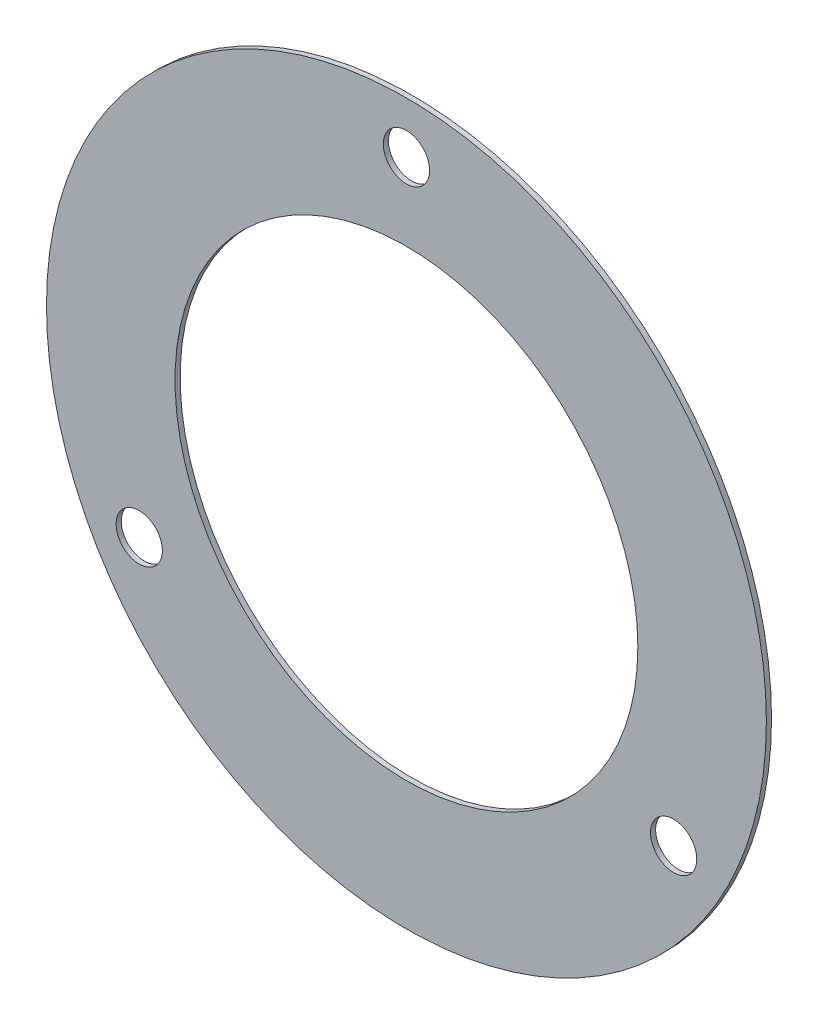
ISO-10303-21;
HEADER;
FILE_DESCRIPTION(('STEP AP214'),'2;1');
FILE_NAME('part.step','',(''),(''),'','','');
FILE_SCHEMA(('AUTOMOTIVE_DESIGN { 1 0 10303 214 1 1 1 1 }'));
ENDSEC;
DATA;
#1=APPLICATION_CONTEXT('core data for automotive mechanical design processes');
#2=APPLICATION_PROTOCOL_DEFINITION('international standard','automotive_design',2000,#1);
#3=PRODUCT_CONTEXT('',#1,'mechanical');
#4=PRODUCT('Part','Part','',(#3));
#5=PRODUCT_RELATED_PRODUCT_CATEGORY('part','',(#4));
#6=PRODUCT_DEFINITION_FORMATION('','',#4);
#7=PRODUCT_DEFINITION_CONTEXT('part definition',#1,'design');
#8=PRODUCT_DEFINITION('design','',#6,#7);
#9=PRODUCT_DEFINITION_SHAPE('','',#8);
#10=(LENGTH_UNIT() NAMED_UNIT(*) SI_UNIT(.MILLI.,.METRE.));
#11=(NAMED_UNIT(*) PLANE_ANGLE_UNIT() SI_UNIT($,.RADIAN.));
#12=(NAMED_UNIT(*) SI_UNIT($,.STERADIAN.) SOLID_ANGLE_UNIT());
#13=UNCERTAINTY_MEASURE_WITH_UNIT(LENGTH_MEASURE(1.E-05),#10,'distance_accuracy_value','');
#14=(GEOMETRIC_REPRESENTATION_CONTEXT(3) GLOBAL_UNCERTAINTY_ASSIGNED_CONTEXT((#13)) GLOBAL_UNIT_ASSIGNED_CONTEXT((#10,
#11,#12)) REPRESENTATION_CONTEXT('',''));
#15=CARTESIAN_POINT('',(0.,0.,0.));
#16=DIRECTION('',(0.,0.,1.));
#17=DIRECTION('',(1.,0.,0.));
#18=AXIS2_PLACEMENT_3D('',#15,#16,#17);
#19=CARTESIAN_POINT('',(0.,0.,1.));
#20=DIRECTION('',(0.,0.,1.));
#21=DIRECTION('',(1.,0.,0.));
#22=AXIS2_PLACEMENT_3D('',#19,#20,#21);
#23=PLANE('',#22);
#24=CARTESIAN_POINT('',(51.9615242270699,-30.0000000000027,1.));
#25=DIRECTION('',(0.,0.,1.));
#26=DIRECTION('',(1.,0.,0.));
#27=AXIS2_PLACEMENT_3D('',#24,#25,#26);
#28=CIRCLE('',#27,4.49999999999842);
#29=CARTESIAN_POINT('',(56.4615242270683,-30.0000000000027,1.));
#30=VERTEX_POINT('',#29);
#31=EDGE_CURVE('E49',#30,#30,#28,.T.);
#32=ORIENTED_EDGE('',*,*,#31,.F.);
#33=EDGE_LOOP('',(#32));
#34=FACE_BOUND('',#33,.T.);
#35=CARTESIAN_POINT('',(0.,0.,1.));
#36=DIRECTION('',(0.,0.,1.));
#37=DIRECTION('',(1.,0.,0.));
#38=AXIS2_PLACEMENT_3D('',#35,#36,#37);
#39=CIRCLE('',#38,45.);
#40=CARTESIAN_POINT('',(45.,0.,1.));
#41=VERTEX_POINT('',#40);
#42=EDGE_CURVE('E38',#41,#41,#39,.T.);
#43=ORIENTED_EDGE('',*,*,#42,.F.);
#44=EDGE_LOOP('',(#43));
#45=FACE_BOUND('',#44,.T.);
#46=CARTESIAN_POINT('',(0.,0.,1.));
#47=DIRECTION('',(0.,0.,1.));
#48=DIRECTION('',(1.,0.,0.));
#49=AXIS2_PLACEMENT_3D('',#46,#47,#48);
#50=CIRCLE('',#49,70.);
#51=CARTESIAN_POINT('',(70.,0.,1.));
#52=VERTEX_POINT('',#51);
#53=EDGE_CURVE('E10',#52,#52,#50,.T.);
#54=ORIENTED_EDGE('',*,*,#53,.T.);
#55=EDGE_LOOP('',(#54));
#56=FACE_BOUND('',#55,.T.);
#57=CARTESIAN_POINT('',(4.413136522885E-12,60.0000000000022,1.));
#58=DIRECTION('',(0.,0.,1.));
#59=DIRECTION('',(1.,0.,0.));
#60=AXIS2_PLACEMENT_3D('',#57,#58,#59);
#61=CIRCLE('',#60,4.49999999999514);
#62=CARTESIAN_POINT('',(4.49999999999955,60.0000000000022,1.));
#63=VERTEX_POINT('',#62);
#64=EDGE_CURVE('E43',#63,#63,#61,.T.);
#65=ORIENTED_EDGE('',*,*,#64,.F.);
#66=EDGE_LOOP('',(#65));
#67=FACE_BOUND('',#66,.T.);
#68=CARTESIAN_POINT('',(-51.9615242270666,-29.9999999999995,1.));
#69=DIRECTION('',(0.,0.,1.));
#70=DIRECTION('',(1.,0.,0.));
#71=AXIS2_PLACEMENT_3D('',#68,#69,#70);
#72=CIRCLE('',#71,4.5);
#73=CARTESIAN_POINT('',(-47.4615242270666,-29.9999999999995,1.));
#74=VERTEX_POINT('',#73);
#75=EDGE_CURVE('E55',#74,#74,#72,.T.);
#76=ORIENTED_EDGE('',*,*,#75,.F.);
#77=EDGE_LOOP('',(#76));
#78=FACE_BOUND('',#77,.T.);
#79=ADVANCED_FACE('F27',(#34,#45,#56,#67,#78),#23,.T.);
#80=CARTESIAN_POINT('',(0.,0.,0.));
#81=DIRECTION('',(0.,0.,1.));
#82=DIRECTION('',(1.,0.,0.));
#83=AXIS2_PLACEMENT_3D('',#80,#81,#82);
#84=PLANE('',#83);
#85=CARTESIAN_POINT('',(0.,0.,0.));
#86=DIRECTION('',(0.,0.,1.));
#87=DIRECTION('',(1.,0.,0.));
#88=AXIS2_PLACEMENT_3D('',#85,#86,#87);
#89=CIRCLE('',#88,70.);
#90=CARTESIAN_POINT('',(70.,0.,0.));
#91=VERTEX_POINT('',#90);
#92=EDGE_CURVE('E31',#91,#91,#89,.T.);
#93=ORIENTED_EDGE('',*,*,#92,.F.);
#94=EDGE_LOOP('',(#93));
#95=FACE_BOUND('',#94,.T.);
#96=CARTESIAN_POINT('',(0.,0.,0.));
#97=DIRECTION('',(0.,0.,1.));
#98=DIRECTION('',(1.,0.,0.));
#99=AXIS2_PLACEMENT_3D('',#96,#97,#98);
#100=CIRCLE('',#99,45.);
#101=CARTESIAN_POINT('',(45.,0.,0.));
#102=VERTEX_POINT('',#101);
#103=EDGE_CURVE('E40',#102,#102,#100,.T.);
#104=ORIENTED_EDGE('',*,*,#103,.T.);
#105=EDGE_LOOP('',(#104));
#106=FACE_BOUND('',#105,.T.);
#107=CARTESIAN_POINT('',(4.413136522885E-12,60.0000000000022,0.));
#108=DIRECTION('',(0.,0.,1.));
#109=DIRECTION('',(1.,0.,0.));
#110=AXIS2_PLACEMENT_3D('',#107,#108,#109);
#111=CIRCLE('',#110,4.49999999999514);
#112=CARTESIAN_POINT('',(4.49999999999955,60.0000000000022,0.));
#113=VERTEX_POINT('',#112);
#114=EDGE_CURVE('E46',#113,#113,#111,.T.);
#115=ORIENTED_EDGE('',*,*,#114,.T.);
#116=EDGE_LOOP('',(#115));
#117=FACE_BOUND('',#116,.T.);
#118=CARTESIAN_POINT('',(51.9615242270699,-30.0000000000027,0.));
#119=DIRECTION('',(0.,0.,1.));
#120=DIRECTION('',(1.,0.,0.));
#121=AXIS2_PLACEMENT_3D('',#118,#119,#120);
#122=CIRCLE('',#121,4.49999999999842);
#123=CARTESIAN_POINT('',(56.4615242270683,-30.0000000000027,0.));
#124=VERTEX_POINT('',#123);
#125=EDGE_CURVE('E52',#124,#124,#122,.T.);
#126=ORIENTED_EDGE('',*,*,#125,.T.);
#127=EDGE_LOOP('',(#126));
#128=FACE_BOUND('',#127,.T.);
#129=CARTESIAN_POINT('',(-51.9615242270666,-29.9999999999995,0.));
#130=DIRECTION('',(0.,0.,1.));
#131=DIRECTION('',(1.,0.,0.));
#132=AXIS2_PLACEMENT_3D('',#129,#130,#131);
#133=CIRCLE('',#132,4.5);
#134=CARTESIAN_POINT('',(-47.4615242270666,-29.9999999999995,0.));
#135=VERTEX_POINT('',#134);
#136=EDGE_CURVE('E58',#135,#135,#133,.T.);
#137=ORIENTED_EDGE('',*,*,#136,.T.);
#138=EDGE_LOOP('',(#137));
#139=FACE_BOUND('',#138,.T.);
#140=ADVANCED_FACE('F68',(#95,#106,#117,#128,#139),#84,.F.);
#141=CARTESIAN_POINT('',(0.,0.,1.));
#142=DIRECTION('',(0.,0.,-1.));
#143=DIRECTION('',(-1.,0.,0.));
#144=AXIS2_PLACEMENT_3D('',#141,#142,#143);
#145=CYLINDRICAL_SURFACE('',#144,70.);
#146=ORIENTED_EDGE('',*,*,#53,.F.);
#147=EDGE_LOOP('',(#146));
#148=FACE_BOUND('',#147,.T.);
#149=ORIENTED_EDGE('',*,*,#92,.T.);
#150=EDGE_LOOP('',(#149));
#151=FACE_BOUND('',#150,.T.);
#152=ADVANCED_FACE('F29',(#148,#151),#145,.T.);
#153=CARTESIAN_POINT('',(0.,0.,1.));
#154=DIRECTION('',(0.,0.,-1.));
#155=DIRECTION('',(-1.,0.,0.));
#156=AXIS2_PLACEMENT_3D('',#153,#154,#155);
#157=CYLINDRICAL_SURFACE('',#156,45.);
#158=ORIENTED_EDGE('',*,*,#42,.T.);
#159=EDGE_LOOP('',(#158));
#160=FACE_BOUND('',#159,.T.);
#161=ORIENTED_EDGE('',*,*,#103,.F.);
#162=EDGE_LOOP('',(#161));
#163=FACE_BOUND('',#162,.T.);
#164=ADVANCED_FACE('F78',(#160,#163),#157,.F.);
#165=CARTESIAN_POINT('',(4.413136522885E-12,60.0000000000022,1.));
#166=DIRECTION('',(0.,0.,-1.));
#167=DIRECTION('',(-1.,0.,0.));
#168=AXIS2_PLACEMENT_3D('',#165,#166,#167);
#169=CYLINDRICAL_SURFACE('',#168,4.49999999999514);
#170=ORIENTED_EDGE('',*,*,#64,.T.);
#171=EDGE_LOOP('',(#170));
#172=FACE_BOUND('',#171,.T.);
#173=ORIENTED_EDGE('',*,*,#114,.F.);
#174=EDGE_LOOP('',(#173));
#175=FACE_BOUND('',#174,.T.);
#176=ADVANCED_FACE('F81',(#172,#175),#169,.F.);
#177=CARTESIAN_POINT('',(51.9615242270699,-30.0000000000027,1.));
#178=DIRECTION('',(0.,0.,-1.));
#179=DIRECTION('',(-1.,0.,0.));
#180=AXIS2_PLACEMENT_3D('',#177,#178,#179);
#181=CYLINDRICAL_SURFACE('',#180,4.49999999999842);
#182=ORIENTED_EDGE('',*,*,#31,.T.);
#183=EDGE_LOOP('',(#182));
#184=FACE_BOUND('',#183,.T.);
#185=ORIENTED_EDGE('',*,*,#125,.F.);
#186=EDGE_LOOP('',(#185));
#187=FACE_BOUND('',#186,.T.);
#188=ADVANCED_FACE('F85',(#184,#187),#181,.F.);
#189=CARTESIAN_POINT('',(-51.9615242270666,-29.9999999999995,1.));
#190=DIRECTION('',(0.,0.,-1.));
#191=DIRECTION('',(-1.,0.,0.));
#192=AXIS2_PLACEMENT_3D('',#189,#190,#191);
#193=CYLINDRICAL_SURFACE('',#192,4.5);
#194=ORIENTED_EDGE('',*,*,#75,.T.);
#195=EDGE_LOOP('',(#194));
#196=FACE_BOUND('',#195,.T.);
#197=ORIENTED_EDGE('',*,*,#136,.F.);
#198=EDGE_LOOP('',(#197));
#199=FACE_BOUND('',#198,.T.);
#200=ADVANCED_FACE('F64',(#196,#199),#193,.F.);
#201=CLOSED_SHELL('',(#79,#140,#152,#164,#176,#188,#200));
#202=MANIFOLD_SOLID_BREP('B2',#201);
#203=ADVANCED_BREP_SHAPE_REPRESENTATION('',(#18,#202),#14);
#204=SHAPE_DEFINITION_REPRESENTATION(#9,#203);
ENDSEC;
END-ISO-10303-21;
